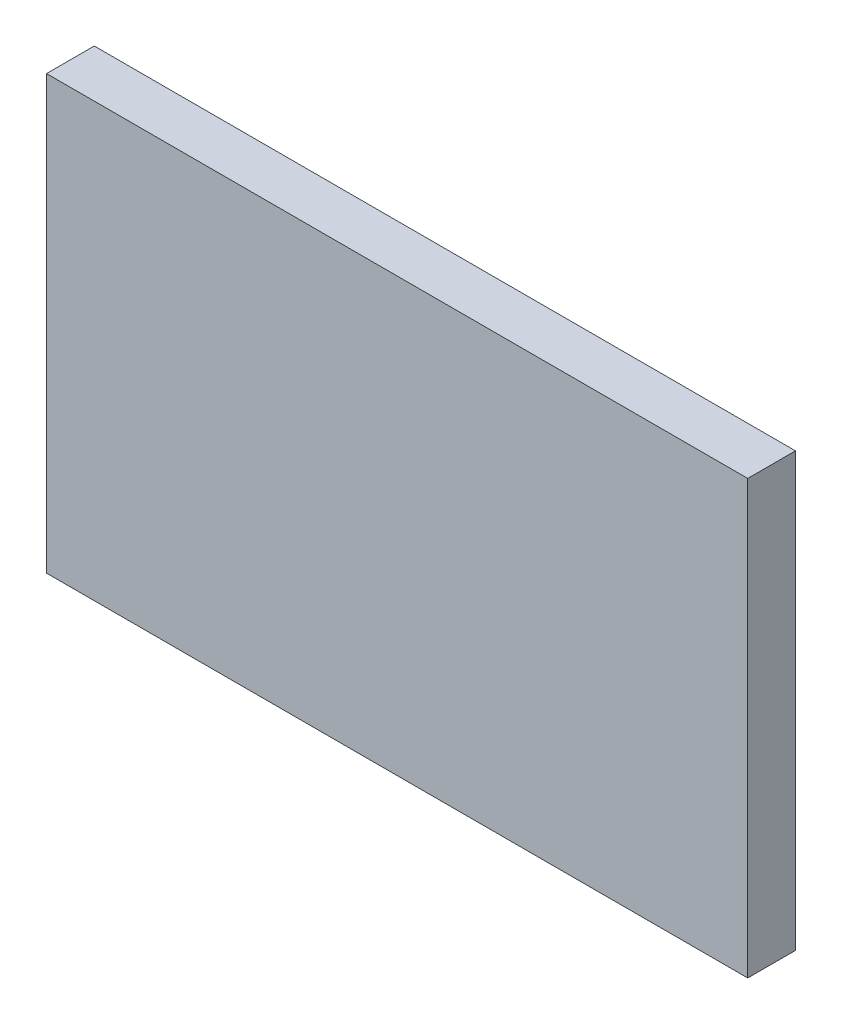
ISO-10303-21;
HEADER;
FILE_DESCRIPTION(('STEP AP214'),'2;1');
FILE_NAME('part.step','',(''),(''),'','','');
FILE_SCHEMA(('AUTOMOTIVE_DESIGN { 1 0 10303 214 1 1 1 1 }'));
ENDSEC;
DATA;
#1=APPLICATION_CONTEXT('core data for automotive mechanical design processes');
#2=APPLICATION_PROTOCOL_DEFINITION('international standard','automotive_design',2000,#1);
#3=PRODUCT_CONTEXT('',#1,'mechanical');
#4=PRODUCT('Part','Part','',(#3));
#5=PRODUCT_RELATED_PRODUCT_CATEGORY('part','',(#4));
#6=PRODUCT_DEFINITION_FORMATION('','',#4);
#7=PRODUCT_DEFINITION_CONTEXT('part definition',#1,'design');
#8=PRODUCT_DEFINITION('design','',#6,#7);
#9=PRODUCT_DEFINITION_SHAPE('','',#8);
#10=(LENGTH_UNIT() NAMED_UNIT(*) SI_UNIT(.MILLI.,.METRE.));
#11=(NAMED_UNIT(*) PLANE_ANGLE_UNIT() SI_UNIT($,.RADIAN.));
#12=(NAMED_UNIT(*) SI_UNIT($,.STERADIAN.) SOLID_ANGLE_UNIT());
#13=UNCERTAINTY_MEASURE_WITH_UNIT(LENGTH_MEASURE(1.E-05),#10,'distance_accuracy_value','');
#14=(GEOMETRIC_REPRESENTATION_CONTEXT(3) GLOBAL_UNCERTAINTY_ASSIGNED_CONTEXT((#13)) GLOBAL_UNIT_ASSIGNED_CONTEXT((#10,
#11,#12)) REPRESENTATION_CONTEXT('',''));
#15=CARTESIAN_POINT('',(0.,0.,0.));
#16=DIRECTION('',(0.,0.,1.));
#17=DIRECTION('',(1.,0.,0.));
#18=AXIS2_PLACEMENT_3D('',#15,#16,#17);
#19=CARTESIAN_POINT('',(117.5,72.5,16.));
#20=DIRECTION('',(-1.,0.,0.));
#21=DIRECTION('',(0.,-1.,0.));
#22=AXIS2_PLACEMENT_3D('',#19,#20,#21);
#23=PLANE('',#22);
#24=DIRECTION('',(0.,1.,0.));
#25=VECTOR('',#24,1.);
#26=CARTESIAN_POINT('',(117.5,72.5,0.));
#27=LINE('',#26,#25);
#28=CARTESIAN_POINT('',(117.5,-72.5,0.));
#29=VERTEX_POINT('',#28);
#30=CARTESIAN_POINT('',(117.5,72.5,0.));
#31=VERTEX_POINT('',#30);
#32=EDGE_CURVE('E100',#29,#31,#27,.T.);
#33=ORIENTED_EDGE('',*,*,#32,.T.);
#34=DIRECTION('',(0.,0.,-1.));
#35=VECTOR('',#34,1.);
#36=CARTESIAN_POINT('',(117.5,72.5,16.));
#37=LINE('',#36,#35);
#38=CARTESIAN_POINT('',(117.5,72.5,16.));
#39=VERTEX_POINT('',#38);
#40=EDGE_CURVE('E11',#39,#31,#37,.T.);
#41=ORIENTED_EDGE('',*,*,#40,.F.);
#42=DIRECTION('',(0.,1.,0.));
#43=VECTOR('',#42,1.);
#44=CARTESIAN_POINT('',(117.5,72.5,16.));
#45=LINE('',#44,#43);
#46=CARTESIAN_POINT('',(117.5,-72.5,16.));
#47=VERTEX_POINT('',#46);
#48=EDGE_CURVE('E88',#47,#39,#45,.T.);
#49=ORIENTED_EDGE('',*,*,#48,.F.);
#50=DIRECTION('',(0.,0.,-1.));
#51=VECTOR('',#50,1.);
#52=CARTESIAN_POINT('',(117.5,-72.5,16.));
#53=LINE('',#52,#51);
#54=EDGE_CURVE('E96',#47,#29,#53,.T.);
#55=ORIENTED_EDGE('',*,*,#54,.T.);
#56=EDGE_LOOP('',(#33,#41,#49,#55));
#57=FACE_BOUND('',#56,.T.);
#58=ADVANCED_FACE('F37',(#57),#23,.F.);
#59=CARTESIAN_POINT('',(-117.5,72.5,16.));
#60=DIRECTION('',(0.,-1.,0.));
#61=DIRECTION('',(0.,0.,-1.));
#62=AXIS2_PLACEMENT_3D('',#59,#60,#61);
#63=PLANE('',#62);
#64=DIRECTION('',(-1.,0.,0.));
#65=VECTOR('',#64,1.);
#66=CARTESIAN_POINT('',(-117.5,72.5,0.));
#67=LINE('',#66,#65);
#68=CARTESIAN_POINT('',(-117.5,72.5,0.));
#69=VERTEX_POINT('',#68);
#70=EDGE_CURVE('E92',#31,#69,#67,.T.);
#71=ORIENTED_EDGE('',*,*,#70,.T.);
#72=DIRECTION('',(0.,0.,-1.));
#73=VECTOR('',#72,1.);
#74=CARTESIAN_POINT('',(-117.5,72.5,16.));
#75=LINE('',#74,#73);
#76=CARTESIAN_POINT('',(-117.5,72.5,16.));
#77=VERTEX_POINT('',#76);
#78=EDGE_CURVE('E45',#77,#69,#75,.T.);
#79=ORIENTED_EDGE('',*,*,#78,.F.);
#80=DIRECTION('',(-1.,0.,0.));
#81=VECTOR('',#80,1.);
#82=CARTESIAN_POINT('',(-117.5,72.5,16.));
#83=LINE('',#82,#81);
#84=EDGE_CURVE('E83',#39,#77,#83,.T.);
#85=ORIENTED_EDGE('',*,*,#84,.F.);
#86=ORIENTED_EDGE('',*,*,#40,.T.);
#87=EDGE_LOOP('',(#71,#79,#85,#86));
#88=FACE_BOUND('',#87,.T.);
#89=ADVANCED_FACE('F91',(#88),#63,.F.);
#90=CARTESIAN_POINT('',(-117.5,72.5,16.));
#91=DIRECTION('',(1.,0.,0.));
#92=DIRECTION('',(0.,1.,0.));
#93=AXIS2_PLACEMENT_3D('',#90,#91,#92);
#94=PLANE('',#93);
#95=DIRECTION('',(0.,-1.,0.));
#96=VECTOR('',#95,1.);
#97=CARTESIAN_POINT('',(-117.5,72.5,0.));
#98=LINE('',#97,#96);
#99=CARTESIAN_POINT('',(-117.5,-72.5,0.));
#100=VERTEX_POINT('',#99);
#101=EDGE_CURVE('E70',#69,#100,#98,.T.);
#102=ORIENTED_EDGE('',*,*,#101,.T.);
#103=DIRECTION('',(0.,0.,-1.));
#104=VECTOR('',#103,1.);
#105=CARTESIAN_POINT('',(-117.5,-72.5,16.));
#106=LINE('',#105,#104);
#107=CARTESIAN_POINT('',(-117.5,-72.5,16.));
#108=VERTEX_POINT('',#107);
#109=EDGE_CURVE('E93',#108,#100,#106,.T.);
#110=ORIENTED_EDGE('',*,*,#109,.F.);
#111=DIRECTION('',(0.,-1.,0.));
#112=VECTOR('',#111,1.);
#113=CARTESIAN_POINT('',(-117.5,72.5,16.));
#114=LINE('',#113,#112);
#115=EDGE_CURVE('E86',#77,#108,#114,.T.);
#116=ORIENTED_EDGE('',*,*,#115,.F.);
#117=ORIENTED_EDGE('',*,*,#78,.T.);
#118=EDGE_LOOP('',(#102,#110,#116,#117));
#119=FACE_BOUND('',#118,.T.);
#120=ADVANCED_FACE('F94',(#119),#94,.F.);
#121=CARTESIAN_POINT('',(-117.5,-72.5,16.));
#122=DIRECTION('',(0.,1.,0.));
#123=DIRECTION('',(0.,0.,1.));
#124=AXIS2_PLACEMENT_3D('',#121,#122,#123);
#125=PLANE('',#124);
#126=DIRECTION('',(1.,0.,0.));
#127=VECTOR('',#126,1.);
#128=CARTESIAN_POINT('',(-117.5,-72.5,0.));
#129=LINE('',#128,#127);
#130=EDGE_CURVE('E76',#100,#29,#129,.T.);
#131=ORIENTED_EDGE('',*,*,#130,.T.);
#132=ORIENTED_EDGE('',*,*,#54,.F.);
#133=DIRECTION('',(1.,0.,0.));
#134=VECTOR('',#133,1.);
#135=CARTESIAN_POINT('',(-117.5,-72.5,16.));
#136=LINE('',#135,#134);
#137=EDGE_CURVE('E53',#108,#47,#136,.T.);
#138=ORIENTED_EDGE('',*,*,#137,.F.);
#139=ORIENTED_EDGE('',*,*,#109,.T.);
#140=EDGE_LOOP('',(#131,#132,#138,#139));
#141=FACE_BOUND('',#140,.T.);
#142=ADVANCED_FACE('F107',(#141),#125,.F.);
#143=CARTESIAN_POINT('',(0.,0.,16.));
#144=DIRECTION('',(0.,0.,1.));
#145=DIRECTION('',(1.,0.,0.));
#146=AXIS2_PLACEMENT_3D('',#143,#144,#145);
#147=PLANE('',#146);
#148=ORIENTED_EDGE('',*,*,#48,.T.);
#149=ORIENTED_EDGE('',*,*,#84,.T.);
#150=ORIENTED_EDGE('',*,*,#115,.T.);
#151=ORIENTED_EDGE('',*,*,#137,.T.);
#152=EDGE_LOOP('',(#148,#149,#150,#151));
#153=FACE_BOUND('',#152,.T.);
#154=ADVANCED_FACE('F84',(#153),#147,.T.);
#155=CARTESIAN_POINT('',(0.,0.,0.));
#156=DIRECTION('',(0.,0.,1.));
#157=DIRECTION('',(1.,0.,0.));
#158=AXIS2_PLACEMENT_3D('',#155,#156,#157);
#159=PLANE('',#158);
#160=ORIENTED_EDGE('',*,*,#32,.F.);
#161=ORIENTED_EDGE('',*,*,#130,.F.);
#162=ORIENTED_EDGE('',*,*,#101,.F.);
#163=ORIENTED_EDGE('',*,*,#70,.F.);
#164=EDGE_LOOP('',(#160,#161,#162,#163));
#165=FACE_BOUND('',#164,.T.);
#166=ADVANCED_FACE('F110',(#165),#159,.F.);
#167=CLOSED_SHELL('',(#58,#89,#120,#142,#154,#166));
#168=MANIFOLD_SOLID_BREP('B2',#167);
#169=ADVANCED_BREP_SHAPE_REPRESENTATION('',(#18,#168),#14);
#170=SHAPE_DEFINITION_REPRESENTATION(#9,#169);
ENDSEC;
END-ISO-10303-21;
